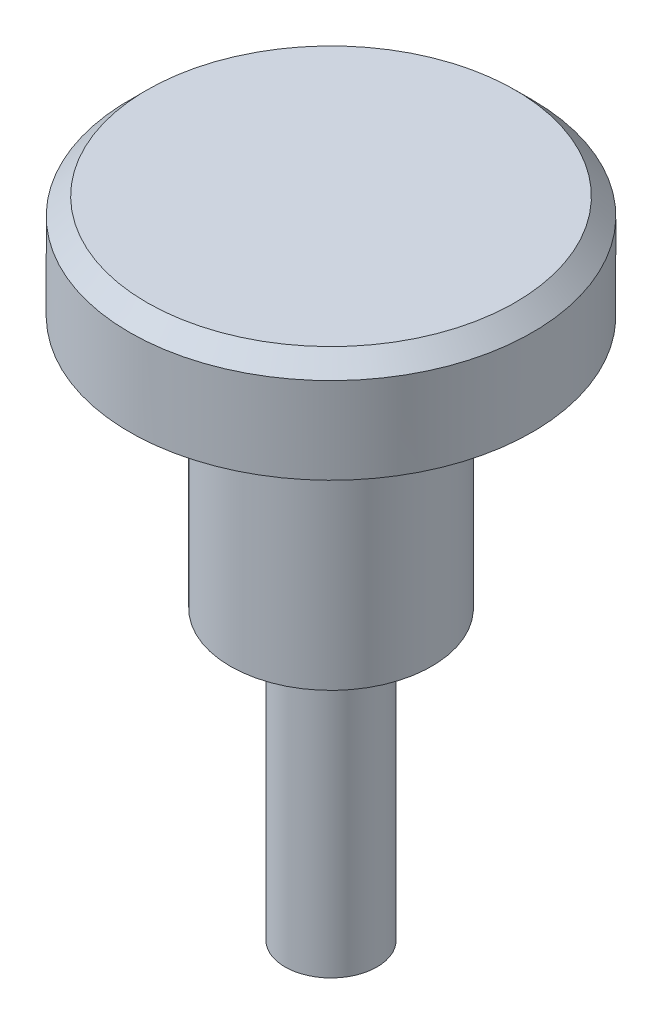
ISO-10303-21;
HEADER;
FILE_DESCRIPTION(('STEP AP214'),'2;1');
FILE_NAME('part.step','',(''),(''),'','','');
FILE_SCHEMA(('AUTOMOTIVE_DESIGN { 1 0 10303 214 1 1 1 1 }'));
ENDSEC;
DATA;
#1=APPLICATION_CONTEXT('core data for automotive mechanical design processes');
#2=APPLICATION_PROTOCOL_DEFINITION('international standard','automotive_design',2000,#1);
#3=PRODUCT_CONTEXT('',#1,'mechanical');
#4=PRODUCT('Part','Part','',(#3));
#5=PRODUCT_RELATED_PRODUCT_CATEGORY('part','',(#4));
#6=PRODUCT_DEFINITION_FORMATION('','',#4);
#7=PRODUCT_DEFINITION_CONTEXT('part definition',#1,'design');
#8=PRODUCT_DEFINITION('design','',#6,#7);
#9=PRODUCT_DEFINITION_SHAPE('','',#8);
#10=(LENGTH_UNIT() NAMED_UNIT(*) SI_UNIT(.MILLI.,.METRE.));
#11=(NAMED_UNIT(*) PLANE_ANGLE_UNIT() SI_UNIT($,.RADIAN.));
#12=(NAMED_UNIT(*) SI_UNIT($,.STERADIAN.) SOLID_ANGLE_UNIT());
#13=UNCERTAINTY_MEASURE_WITH_UNIT(LENGTH_MEASURE(1.E-05),#10,'distance_accuracy_value','');
#14=(GEOMETRIC_REPRESENTATION_CONTEXT(3) GLOBAL_UNCERTAINTY_ASSIGNED_CONTEXT((#13)) GLOBAL_UNIT_ASSIGNED_CONTEXT((#10,
#11,#12)) REPRESENTATION_CONTEXT('',''));
#15=CARTESIAN_POINT('',(0.,0.,0.));
#16=DIRECTION('',(0.,0.,1.));
#17=DIRECTION('',(1.,0.,0.));
#18=AXIS2_PLACEMENT_3D('',#15,#16,#17);
#19=CARTESIAN_POINT('',(0.,0.,0.));
#20=DIRECTION('',(0.,-1.,0.));
#21=DIRECTION('',(0.,0.,-1.));
#22=AXIS2_PLACEMENT_3D('',#19,#20,#21);
#23=PLANE('',#22);
#24=CARTESIAN_POINT('',(0.,0.,0.));
#25=DIRECTION('',(0.,-1.,0.));
#26=DIRECTION('',(0.,0.,-1.));
#27=AXIS2_PLACEMENT_3D('',#24,#25,#26);
#28=CIRCLE('',#27,8.);
#29=CARTESIAN_POINT('',(0.,0.,-8.));
#30=VERTEX_POINT('',#29);
#31=EDGE_CURVE('E59',#30,#30,#28,.T.);
#32=ORIENTED_EDGE('',*,*,#31,.T.);
#33=EDGE_LOOP('',(#32));
#34=FACE_BOUND('',#33,.T.);
#35=ADVANCED_FACE('F47',(#34),#23,.T.);
#36=CARTESIAN_POINT('',(0.,0.,0.));
#37=DIRECTION('',(0.,-1.,0.));
#38=DIRECTION('',(0.,0.,-1.));
#39=AXIS2_PLACEMENT_3D('',#36,#37,#38);
#40=CYLINDRICAL_SURFACE('',#39,8.);
#41=CARTESIAN_POINT('',(0.,50.,0.));
#42=DIRECTION('',(0.,-1.,0.));
#43=DIRECTION('',(0.,0.,-1.));
#44=AXIS2_PLACEMENT_3D('',#41,#42,#43);
#45=CIRCLE('',#44,8.);
#46=CARTESIAN_POINT('',(0.,50.,-8.));
#47=VERTEX_POINT('',#46);
#48=EDGE_CURVE('E63',#47,#47,#45,.T.);
#49=ORIENTED_EDGE('',*,*,#48,.T.);
#50=EDGE_LOOP('',(#49));
#51=FACE_BOUND('',#50,.T.);
#52=ORIENTED_EDGE('',*,*,#31,.F.);
#53=EDGE_LOOP('',(#52));
#54=FACE_BOUND('',#53,.T.);
#55=ADVANCED_FACE('F93',(#51,#54),#40,.T.);
#56=CARTESIAN_POINT('',(8.,50.,0.));
#57=DIRECTION('',(0.,-1.,0.));
#58=DIRECTION('',(0.,0.,-1.));
#59=AXIS2_PLACEMENT_3D('',#56,#57,#58);
#60=PLANE('',#59);
#61=CARTESIAN_POINT('',(0.,50.,0.));
#62=DIRECTION('',(0.,-1.,0.));
#63=DIRECTION('',(0.,0.,-1.));
#64=AXIS2_PLACEMENT_3D('',#61,#62,#63);
#65=CIRCLE('',#64,17.5);
#66=CARTESIAN_POINT('',(0.,50.,-17.5));
#67=VERTEX_POINT('',#66);
#68=EDGE_CURVE('E68',#67,#67,#65,.T.);
#69=ORIENTED_EDGE('',*,*,#68,.T.);
#70=EDGE_LOOP('',(#69));
#71=FACE_BOUND('',#70,.T.);
#72=ORIENTED_EDGE('',*,*,#48,.F.);
#73=EDGE_LOOP('',(#72));
#74=FACE_BOUND('',#73,.T.);
#75=ADVANCED_FACE('F98',(#71,#74),#60,.T.);
#76=CARTESIAN_POINT('',(0.,0.,0.));
#77=DIRECTION('',(0.,-1.,0.));
#78=DIRECTION('',(0.,0.,-1.));
#79=AXIS2_PLACEMENT_3D('',#76,#77,#78);
#80=CYLINDRICAL_SURFACE('',#79,17.5);
#81=CARTESIAN_POINT('',(0.,94.,0.));
#82=DIRECTION('',(0.,-1.,0.));
#83=DIRECTION('',(0.,0.,-1.));
#84=AXIS2_PLACEMENT_3D('',#81,#82,#83);
#85=CIRCLE('',#84,17.5);
#86=CARTESIAN_POINT('',(0.,94.,-17.5));
#87=VERTEX_POINT('',#86);
#88=EDGE_CURVE('E71',#87,#87,#85,.T.);
#89=ORIENTED_EDGE('',*,*,#88,.T.);
#90=EDGE_LOOP('',(#89));
#91=FACE_BOUND('',#90,.T.);
#92=ORIENTED_EDGE('',*,*,#68,.F.);
#93=EDGE_LOOP('',(#92));
#94=FACE_BOUND('',#93,.T.);
#95=ADVANCED_FACE('F90',(#91,#94),#80,.T.);
#96=CARTESIAN_POINT('',(35.,94.,0.));
#97=DIRECTION('',(0.,-1.,0.));
#98=DIRECTION('',(0.,0.,-1.));
#99=AXIS2_PLACEMENT_3D('',#96,#97,#98);
#100=PLANE('',#99);
#101=CARTESIAN_POINT('',(0.,94.,0.));
#102=DIRECTION('',(0.,-1.,0.));
#103=DIRECTION('',(0.,0.,-1.));
#104=AXIS2_PLACEMENT_3D('',#101,#102,#103);
#105=CIRCLE('',#104,35.);
#106=CARTESIAN_POINT('',(0.,94.,-35.));
#107=VERTEX_POINT('',#106);
#108=EDGE_CURVE('E74',#107,#107,#105,.T.);
#109=ORIENTED_EDGE('',*,*,#108,.T.);
#110=EDGE_LOOP('',(#109));
#111=FACE_BOUND('',#110,.T.);
#112=ORIENTED_EDGE('',*,*,#88,.F.);
#113=EDGE_LOOP('',(#112));
#114=FACE_BOUND('',#113,.T.);
#115=ADVANCED_FACE('F78',(#111,#114),#100,.T.);
#116=CARTESIAN_POINT('',(0.,0.,0.));
#117=DIRECTION('',(0.,-1.,0.));
#118=DIRECTION('',(0.,0.,-1.));
#119=AXIS2_PLACEMENT_3D('',#116,#117,#118);
#120=CYLINDRICAL_SURFACE('',#119,35.);
#121=CARTESIAN_POINT('',(0.,109.,0.));
#122=DIRECTION('',(0.,1.,0.));
#123=DIRECTION('',(0.,0.,1.));
#124=AXIS2_PLACEMENT_3D('',#121,#122,#123);
#125=CIRCLE('',#124,35.);
#126=CARTESIAN_POINT('',(0.,109.,35.));
#127=VERTEX_POINT('',#126);
#128=EDGE_CURVE('E55',#127,#127,#125,.F.);
#129=ORIENTED_EDGE('',*,*,#128,.T.);
#130=EDGE_LOOP('',(#129));
#131=FACE_BOUND('',#130,.T.);
#132=ORIENTED_EDGE('',*,*,#108,.F.);
#133=EDGE_LOOP('',(#132));
#134=FACE_BOUND('',#133,.T.);
#135=ADVANCED_FACE('F81',(#131,#134),#120,.T.);
#136=CARTESIAN_POINT('',(0.,112.,0.));
#137=DIRECTION('',(0.,1.,0.));
#138=DIRECTION('',(0.,0.,1.));
#139=AXIS2_PLACEMENT_3D('',#136,#137,#138);
#140=PLANE('',#139);
#141=CARTESIAN_POINT('',(0.,112.,0.));
#142=DIRECTION('',(0.,1.,0.));
#143=DIRECTION('',(0.,0.,1.));
#144=AXIS2_PLACEMENT_3D('',#141,#142,#143);
#145=CIRCLE('',#144,32.);
#146=CARTESIAN_POINT('',(0.,112.,32.));
#147=VERTEX_POINT('',#146);
#148=EDGE_CURVE('E10',#147,#147,#145,.T.);
#149=ORIENTED_EDGE('',*,*,#148,.T.);
#150=EDGE_LOOP('',(#149));
#151=FACE_BOUND('',#150,.T.);
#152=ADVANCED_FACE('F83',(#151),#140,.T.);
#153=CARTESIAN_POINT('',(0.,109.,0.));
#154=DIRECTION('',(0.,-1.,0.));
#155=DIRECTION('',(0.,0.,-1.));
#156=AXIS2_PLACEMENT_3D('',#153,#154,#155);
#157=CONICAL_SURFACE('',#156,35.,0.785398163397451);
#158=ORIENTED_EDGE('',*,*,#148,.F.);
#159=EDGE_LOOP('',(#158));
#160=FACE_BOUND('',#159,.T.);
#161=ORIENTED_EDGE('',*,*,#128,.F.);
#162=EDGE_LOOP('',(#161));
#163=FACE_BOUND('',#162,.T.);
#164=ADVANCED_FACE('F50',(#160,#163),#157,.T.);
#165=CLOSED_SHELL('',(#35,#55,#75,#95,#115,#135,#152,#164));
#166=MANIFOLD_SOLID_BREP('B2',#165);
#167=ADVANCED_BREP_SHAPE_REPRESENTATION('',(#18,#166),#14);
#168=SHAPE_DEFINITION_REPRESENTATION(#9,#167);
ENDSEC;
END-ISO-10303-21;
